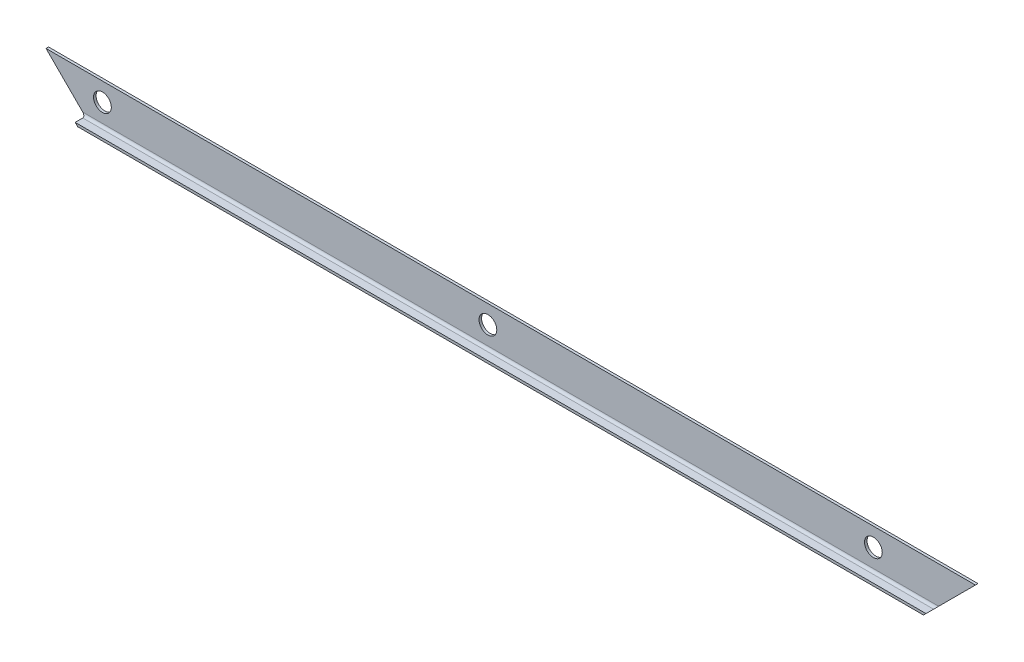
ISO-10303-21;
HEADER;
FILE_DESCRIPTION(('STEP AP214'),'2;1');
FILE_NAME('part.step','',(''),(''),'','','');
FILE_SCHEMA(('AUTOMOTIVE_DESIGN { 1 0 10303 214 1 1 1 1 }'));
ENDSEC;
DATA;
#1=APPLICATION_CONTEXT('core data for automotive mechanical design processes');
#2=APPLICATION_PROTOCOL_DEFINITION('international standard','automotive_design',2000,#1);
#3=PRODUCT_CONTEXT('',#1,'mechanical');
#4=PRODUCT('Part','Part','',(#3));
#5=PRODUCT_RELATED_PRODUCT_CATEGORY('part','',(#4));
#6=PRODUCT_DEFINITION_FORMATION('','',#4);
#7=PRODUCT_DEFINITION_CONTEXT('part definition',#1,'design');
#8=PRODUCT_DEFINITION('design','',#6,#7);
#9=PRODUCT_DEFINITION_SHAPE('','',#8);
#10=(LENGTH_UNIT() NAMED_UNIT(*) SI_UNIT(.MILLI.,.METRE.));
#11=(NAMED_UNIT(*) PLANE_ANGLE_UNIT() SI_UNIT($,.RADIAN.));
#12=(NAMED_UNIT(*) SI_UNIT($,.STERADIAN.) SOLID_ANGLE_UNIT());
#13=UNCERTAINTY_MEASURE_WITH_UNIT(LENGTH_MEASURE(1.E-05),#10,'distance_accuracy_value','');
#14=(GEOMETRIC_REPRESENTATION_CONTEXT(3) GLOBAL_UNCERTAINTY_ASSIGNED_CONTEXT((#13)) GLOBAL_UNIT_ASSIGNED_CONTEXT((#10,
#11,#12)) REPRESENTATION_CONTEXT('',''));
#15=CARTESIAN_POINT('',(0.,0.,0.));
#16=DIRECTION('',(0.,0.,1.));
#17=DIRECTION('',(1.,0.,0.));
#18=AXIS2_PLACEMENT_3D('',#15,#16,#17);
#19=CARTESIAN_POINT('',(0.,0.,-2.));
#20=DIRECTION('',(0.,0.,-1.));
#21=DIRECTION('',(-1.,0.,0.));
#22=AXIS2_PLACEMENT_3D('',#19,#20,#21);
#23=PLANE('',#22);
#24=CARTESIAN_POINT('',(285.999999999994,2.,-2.));
#25=DIRECTION('',(0.,0.,-1.));
#26=DIRECTION('',(-1.,0.,0.));
#27=AXIS2_PLACEMENT_3D('',#24,#25,#26);
#28=CIRCLE('',#27,7.00000000000005);
#29=CARTESIAN_POINT('',(278.999999999994,2.,-2.));
#30=VERTEX_POINT('',#29);
#31=EDGE_CURVE('E148',#30,#30,#28,.T.);
#32=ORIENTED_EDGE('',*,*,#31,.F.);
#33=EDGE_LOOP('',(#32));
#34=FACE_BOUND('',#33,.T.);
#35=CARTESIAN_POINT('',(-18.0000000000063,2.,-2.));
#36=DIRECTION('',(0.,0.,-1.));
#37=DIRECTION('',(-1.,0.,0.));
#38=AXIS2_PLACEMENT_3D('',#35,#36,#37);
#39=CIRCLE('',#38,7.00000000000004);
#40=CARTESIAN_POINT('',(-25.0000000000064,2.,-2.));
#41=VERTEX_POINT('',#40);
#42=EDGE_CURVE('E203',#41,#41,#39,.T.);
#43=ORIENTED_EDGE('',*,*,#42,.F.);
#44=EDGE_LOOP('',(#43));
#45=FACE_BOUND('',#44,.T.);
#46=CARTESIAN_POINT('',(-322.000000000006,2.,-2.));
#47=DIRECTION('',(0.,0.,-1.));
#48=DIRECTION('',(-1.,0.,0.));
#49=AXIS2_PLACEMENT_3D('',#46,#47,#48);
#50=CIRCLE('',#49,7.00000000000005);
#51=CARTESIAN_POINT('',(-329.000000000006,2.,-2.));
#52=VERTEX_POINT('',#51);
#53=EDGE_CURVE('E195',#52,#52,#50,.T.);
#54=ORIENTED_EDGE('',*,*,#53,.F.);
#55=EDGE_LOOP('',(#54));
#56=FACE_BOUND('',#55,.T.);
#57=DIRECTION('',(-1.,0.,0.));
#58=VECTOR('',#57,1.);
#59=CARTESIAN_POINT('',(-540.,16.5,-2.));
#60=LINE('',#59,#58);
#61=CARTESIAN_POINT('',(366.500000000006,16.5,-2.));
#62=VERTEX_POINT('',#61);
#63=CARTESIAN_POINT('',(-366.500000000006,16.5,-2.));
#64=VERTEX_POINT('',#63);
#65=EDGE_CURVE('E128',#62,#64,#60,.T.);
#66=ORIENTED_EDGE('',*,*,#65,.F.);
#67=DIRECTION('',(-0.707106781186551,-0.707106781186544,0.));
#68=VECTOR('',#67,1.);
#69=CARTESIAN_POINT('',(175.000000000001,-175.000000000003,-2.));
#70=LINE('',#69,#68);
#71=CARTESIAN_POINT('',(337.500000000006,-12.5,-2.00000000000003));
#72=VERTEX_POINT('',#71);
#73=EDGE_CURVE('E187',#62,#72,#70,.T.);
#74=ORIENTED_EDGE('',*,*,#73,.T.);
#75=DIRECTION('',(1.,0.,0.));
#76=VECTOR('',#75,1.);
#77=CARTESIAN_POINT('',(540.,-12.5,-2.00000000000003));
#78=LINE('',#77,#76);
#79=CARTESIAN_POINT('',(-337.500000000006,-12.5,-2.00000000000003));
#80=VERTEX_POINT('',#79);
#81=EDGE_CURVE('E149',#72,#80,#78,.F.);
#82=ORIENTED_EDGE('',*,*,#81,.T.);
#83=DIRECTION('',(-0.707106781186551,0.707106781186544,0.));
#84=VECTOR('',#83,1.);
#85=CARTESIAN_POINT('',(-175.000000000001,-175.000000000003,-2.));
#86=LINE('',#85,#84);
#87=EDGE_CURVE('E173',#80,#64,#86,.T.);
#88=ORIENTED_EDGE('',*,*,#87,.T.);
#89=EDGE_LOOP('',(#66,#74,#82,#88));
#90=FACE_BOUND('',#89,.T.);
#91=ADVANCED_FACE('F59',(#34,#45,#56,#90),#23,.T.);
#92=CARTESIAN_POINT('',(0.,0.,0.));
#93=DIRECTION('',(0.,0.,-1.));
#94=DIRECTION('',(-1.,0.,0.));
#95=AXIS2_PLACEMENT_3D('',#92,#93,#94);
#96=PLANE('',#95);
#97=CARTESIAN_POINT('',(285.999999999994,2.,0.));
#98=DIRECTION('',(0.,0.,1.));
#99=DIRECTION('',(1.,0.,0.));
#100=AXIS2_PLACEMENT_3D('',#97,#98,#99);
#101=CIRCLE('',#100,7.00000000000005);
#102=CARTESIAN_POINT('',(292.999999999994,2.,0.));
#103=VERTEX_POINT('',#102);
#104=EDGE_CURVE('E191',#103,#103,#101,.T.);
#105=ORIENTED_EDGE('',*,*,#104,.F.);
#106=EDGE_LOOP('',(#105));
#107=FACE_BOUND('',#106,.T.);
#108=CARTESIAN_POINT('',(-18.0000000000063,2.,0.));
#109=DIRECTION('',(0.,0.,1.));
#110=DIRECTION('',(1.,0.,0.));
#111=AXIS2_PLACEMENT_3D('',#108,#109,#110);
#112=CIRCLE('',#111,7.00000000000004);
#113=CARTESIAN_POINT('',(-11.0000000000063,2.,0.));
#114=VERTEX_POINT('',#113);
#115=EDGE_CURVE('E196',#114,#114,#112,.T.);
#116=ORIENTED_EDGE('',*,*,#115,.F.);
#117=EDGE_LOOP('',(#116));
#118=FACE_BOUND('',#117,.T.);
#119=CARTESIAN_POINT('',(-322.000000000006,2.,0.));
#120=DIRECTION('',(0.,0.,1.));
#121=DIRECTION('',(1.,0.,0.));
#122=AXIS2_PLACEMENT_3D('',#119,#120,#121);
#123=CIRCLE('',#122,7.00000000000005);
#124=CARTESIAN_POINT('',(-315.000000000006,2.,0.));
#125=VERTEX_POINT('',#124);
#126=EDGE_CURVE('E192',#125,#125,#123,.T.);
#127=ORIENTED_EDGE('',*,*,#126,.F.);
#128=EDGE_LOOP('',(#127));
#129=FACE_BOUND('',#128,.T.);
#130=DIRECTION('',(-0.707106781186551,-0.707106781186544,0.));
#131=VECTOR('',#130,1.);
#132=CARTESIAN_POINT('',(175.000000000001,-175.000000000003,0.));
#133=LINE('',#132,#131);
#134=CARTESIAN_POINT('',(366.500000000006,16.5,0.));
#135=VERTEX_POINT('',#134);
#136=CARTESIAN_POINT('',(337.500000000006,-12.5,0.));
#137=VERTEX_POINT('',#136);
#138=EDGE_CURVE('E165',#135,#137,#133,.T.);
#139=ORIENTED_EDGE('',*,*,#138,.F.);
#140=DIRECTION('',(-1.,0.,0.));
#141=VECTOR('',#140,1.);
#142=CARTESIAN_POINT('',(-540.,16.5,0.));
#143=LINE('',#142,#141);
#144=CARTESIAN_POINT('',(-366.500000000006,16.5,0.));
#145=VERTEX_POINT('',#144);
#146=EDGE_CURVE('E152',#135,#145,#143,.T.);
#147=ORIENTED_EDGE('',*,*,#146,.T.);
#148=DIRECTION('',(-0.707106781186551,0.707106781186544,0.));
#149=VECTOR('',#148,1.);
#150=CARTESIAN_POINT('',(-175.000000000001,-175.000000000003,0.));
#151=LINE('',#150,#149);
#152=CARTESIAN_POINT('',(-337.500000000006,-12.5,0.));
#153=VERTEX_POINT('',#152);
#154=EDGE_CURVE('E164',#153,#145,#151,.T.);
#155=ORIENTED_EDGE('',*,*,#154,.F.);
#156=DIRECTION('',(1.,0.,0.));
#157=VECTOR('',#156,1.);
#158=CARTESIAN_POINT('',(540.,-12.5,0.));
#159=LINE('',#158,#157);
#160=EDGE_CURVE('E141',#137,#153,#159,.F.);
#161=ORIENTED_EDGE('',*,*,#160,.F.);
#162=EDGE_LOOP('',(#139,#147,#155,#161));
#163=FACE_BOUND('',#162,.T.);
#164=ADVANCED_FACE('F162',(#107,#118,#129,#163),#96,.F.);
#165=CARTESIAN_POINT('',(-540.,16.5,-2.));
#166=DIRECTION('',(0.,1.,0.));
#167=DIRECTION('',(0.,0.,1.));
#168=AXIS2_PLACEMENT_3D('',#165,#166,#167);
#169=PLANE('',#168);
#170=ORIENTED_EDGE('',*,*,#146,.F.);
#171=DIRECTION('',(0.,0.,-1.));
#172=VECTOR('',#171,1.);
#173=CARTESIAN_POINT('',(366.500000000006,16.5,-2.));
#174=LINE('',#173,#172);
#175=EDGE_CURVE('E169',#135,#62,#174,.T.);
#176=ORIENTED_EDGE('',*,*,#175,.T.);
#177=ORIENTED_EDGE('',*,*,#65,.T.);
#178=DIRECTION('',(0.,0.,1.));
#179=VECTOR('',#178,1.);
#180=CARTESIAN_POINT('',(-366.500000000006,16.5,-2.));
#181=LINE('',#180,#179);
#182=EDGE_CURVE('E171',#64,#145,#181,.T.);
#183=ORIENTED_EDGE('',*,*,#182,.T.);
#184=EDGE_LOOP('',(#170,#176,#177,#183));
#185=FACE_BOUND('',#184,.T.);
#186=ADVANCED_FACE('F61',(#185),#169,.T.);
#187=CARTESIAN_POINT('',(540.,-12.5,1.99999999999997));
#188=DIRECTION('',(1.,0.,0.));
#189=DIRECTION('',(0.,-1.,0.));
#190=AXIS2_PLACEMENT_3D('',#187,#188,#189);
#191=CYLINDRICAL_SURFACE('',#190,4.);
#192=ORIENTED_EDGE('',*,*,#81,.F.);
#193=CARTESIAN_POINT('',(337.500000000006,-12.5,1.99999999999997));
#194=DIRECTION('',(0.707106781186544,-0.707106781186551,0.));
#195=DIRECTION('',(0.707106781186551,0.707106781186544,0.));
#196=AXIS2_PLACEMENT_3D('',#193,#194,#195);
#197=ELLIPSE('',#196,5.65685424949241,4.);
#198=CARTESIAN_POINT('',(333.500000000006,-16.5,1.99999999999993));
#199=VERTEX_POINT('',#198);
#200=EDGE_CURVE('E183',#72,#199,#197,.F.);
#201=ORIENTED_EDGE('',*,*,#200,.T.);
#202=DIRECTION('',(1.,0.,0.));
#203=VECTOR('',#202,1.);
#204=CARTESIAN_POINT('',(-540.,-16.5,1.99999999999999));
#205=LINE('',#204,#203);
#206=CARTESIAN_POINT('',(-333.500000000006,-16.5,1.99999999999993));
#207=VERTEX_POINT('',#206);
#208=EDGE_CURVE('E139',#199,#207,#205,.F.);
#209=ORIENTED_EDGE('',*,*,#208,.T.);
#210=CARTESIAN_POINT('',(-337.500000000006,-12.5,1.99999999999997));
#211=DIRECTION('',(-0.707106781186544,-0.707106781186551,0.));
#212=DIRECTION('',(0.707106781186551,-0.707106781186544,0.));
#213=AXIS2_PLACEMENT_3D('',#210,#211,#212);
#214=ELLIPSE('',#213,5.65685424949241,4.);
#215=EDGE_CURVE('E220',#207,#80,#214,.F.);
#216=ORIENTED_EDGE('',*,*,#215,.T.);
#217=EDGE_LOOP('',(#192,#201,#209,#216));
#218=FACE_BOUND('',#217,.T.);
#219=ADVANCED_FACE('F222',(#218),#191,.T.);
#220=CARTESIAN_POINT('',(540.,-12.5,1.99999999999997));
#221=DIRECTION('',(1.,0.,0.));
#222=DIRECTION('',(0.,-1.,0.));
#223=AXIS2_PLACEMENT_3D('',#220,#221,#222);
#224=CYLINDRICAL_SURFACE('',#223,2.);
#225=CARTESIAN_POINT('',(337.500000000006,-12.5,1.99999999999997));
#226=DIRECTION('',(0.707106781186544,-0.707106781186551,0.));
#227=DIRECTION('',(0.707106781186551,0.707106781186544,0.));
#228=AXIS2_PLACEMENT_3D('',#225,#226,#227);
#229=ELLIPSE('',#228,2.8284271247462,2.);
#230=CARTESIAN_POINT('',(335.500000000006,-14.5,1.99999999999994));
#231=VERTEX_POINT('',#230);
#232=EDGE_CURVE('E181',#137,#231,#229,.F.);
#233=ORIENTED_EDGE('',*,*,#232,.F.);
#234=ORIENTED_EDGE('',*,*,#160,.T.);
#235=CARTESIAN_POINT('',(-337.500000000006,-12.5,1.99999999999997));
#236=DIRECTION('',(-0.707106781186544,-0.707106781186551,0.));
#237=DIRECTION('',(0.707106781186551,-0.707106781186544,0.));
#238=AXIS2_PLACEMENT_3D('',#235,#236,#237);
#239=ELLIPSE('',#238,2.8284271247462,2.);
#240=CARTESIAN_POINT('',(-335.500000000006,-14.5,1.99999999999994));
#241=VERTEX_POINT('',#240);
#242=EDGE_CURVE('E224',#241,#153,#239,.F.);
#243=ORIENTED_EDGE('',*,*,#242,.F.);
#244=DIRECTION('',(1.,0.,0.));
#245=VECTOR('',#244,1.);
#246=CARTESIAN_POINT('',(-540.,-14.5,1.99999999999999));
#247=LINE('',#246,#245);
#248=EDGE_CURVE('E135',#241,#231,#247,.T.);
#249=ORIENTED_EDGE('',*,*,#248,.T.);
#250=EDGE_LOOP('',(#233,#234,#243,#249));
#251=FACE_BOUND('',#250,.T.);
#252=ADVANCED_FACE('F230',(#251),#224,.F.);
#253=CARTESIAN_POINT('',(0.,-16.5,0.));
#254=DIRECTION('',(0.,1.,0.));
#255=DIRECTION('',(0.,0.,1.));
#256=AXIS2_PLACEMENT_3D('',#253,#254,#255);
#257=PLANE('',#256);
#258=DIRECTION('',(0.,0.,-1.));
#259=VECTOR('',#258,1.);
#260=CARTESIAN_POINT('',(333.500000000006,-16.5,1.09283172109164E-12));
#261=LINE('',#260,#259);
#262=CARTESIAN_POINT('',(333.500000000006,-16.5000000000001,8.));
#263=VERTEX_POINT('',#262);
#264=EDGE_CURVE('E175',#263,#199,#261,.T.);
#265=ORIENTED_EDGE('',*,*,#264,.F.);
#266=DIRECTION('',(-1.,0.,0.));
#267=VECTOR('',#266,1.);
#268=CARTESIAN_POINT('',(0.,-16.5,8.));
#269=LINE('',#268,#267);
#270=CARTESIAN_POINT('',(-333.500000000006,-16.5000000000001,8.));
#271=VERTEX_POINT('',#270);
#272=EDGE_CURVE('E138',#263,#271,#269,.T.);
#273=ORIENTED_EDGE('',*,*,#272,.T.);
#274=DIRECTION('',(0.,0.,1.));
#275=VECTOR('',#274,1.);
#276=CARTESIAN_POINT('',(-333.500000000006,-16.5,1.09283172109164E-12));
#277=LINE('',#276,#275);
#278=EDGE_CURVE('E74',#207,#271,#277,.T.);
#279=ORIENTED_EDGE('',*,*,#278,.F.);
#280=ORIENTED_EDGE('',*,*,#208,.F.);
#281=EDGE_LOOP('',(#265,#273,#279,#280));
#282=FACE_BOUND('',#281,.T.);
#283=ADVANCED_FACE('F234',(#282),#257,.F.);
#284=CARTESIAN_POINT('',(0.,-14.5,0.));
#285=DIRECTION('',(0.,1.,0.));
#286=DIRECTION('',(0.,0.,1.));
#287=AXIS2_PLACEMENT_3D('',#284,#285,#286);
#288=PLANE('',#287);
#289=DIRECTION('',(1.,0.,0.));
#290=VECTOR('',#289,1.);
#291=CARTESIAN_POINT('',(-540.,-14.5,8.00000000000001));
#292=LINE('',#291,#290);
#293=CARTESIAN_POINT('',(335.500000000006,-14.5,8.00000000000001));
#294=VERTEX_POINT('',#293);
#295=CARTESIAN_POINT('',(-335.500000000006,-14.5,8.00000000000001));
#296=VERTEX_POINT('',#295);
#297=EDGE_CURVE('E133',#294,#296,#292,.F.);
#298=ORIENTED_EDGE('',*,*,#297,.F.);
#299=DIRECTION('',(0.,0.,-1.));
#300=VECTOR('',#299,1.);
#301=CARTESIAN_POINT('',(335.500000000006,-14.5,1.10675357767323E-12));
#302=LINE('',#301,#300);
#303=EDGE_CURVE('E81',#294,#231,#302,.T.);
#304=ORIENTED_EDGE('',*,*,#303,.T.);
#305=ORIENTED_EDGE('',*,*,#248,.F.);
#306=DIRECTION('',(0.,0.,1.));
#307=VECTOR('',#306,1.);
#308=CARTESIAN_POINT('',(-335.500000000006,-14.5,1.10675357767323E-12));
#309=LINE('',#308,#307);
#310=EDGE_CURVE('E122',#241,#296,#309,.T.);
#311=ORIENTED_EDGE('',*,*,#310,.T.);
#312=EDGE_LOOP('',(#298,#304,#305,#311));
#313=FACE_BOUND('',#312,.T.);
#314=ADVANCED_FACE('F132',(#313),#288,.T.);
#315=CARTESIAN_POINT('',(-540.,-16.5,8.));
#316=DIRECTION('',(0.,0.,-1.));
#317=DIRECTION('',(0.,1.,0.));
#318=AXIS2_PLACEMENT_3D('',#315,#316,#317);
#319=PLANE('',#318);
#320=DIRECTION('',(-0.707106781186551,-0.707106781186544,0.));
#321=VECTOR('',#320,1.);
#322=CARTESIAN_POINT('',(-103.250000000001,-453.250000000003,7.99999999999847));
#323=LINE('',#322,#321);
#324=EDGE_CURVE('E13',#294,#263,#323,.T.);
#325=ORIENTED_EDGE('',*,*,#324,.F.);
#326=ORIENTED_EDGE('',*,*,#297,.T.);
#327=DIRECTION('',(-0.707106781186551,0.707106781186544,0.));
#328=VECTOR('',#327,1.);
#329=CARTESIAN_POINT('',(-436.750000000004,86.749999999997,8.00000000000036));
#330=LINE('',#329,#328);
#331=EDGE_CURVE('E67',#271,#296,#330,.T.);
#332=ORIENTED_EDGE('',*,*,#331,.F.);
#333=ORIENTED_EDGE('',*,*,#272,.F.);
#334=EDGE_LOOP('',(#325,#326,#332,#333));
#335=FACE_BOUND('',#334,.T.);
#336=ADVANCED_FACE('F137',(#335),#319,.F.);
#337=CARTESIAN_POINT('',(-322.000000000006,2.,-10.));
#338=DIRECTION('',(0.,0.,1.));
#339=DIRECTION('',(1.,0.,0.));
#340=AXIS2_PLACEMENT_3D('',#337,#338,#339);
#341=CYLINDRICAL_SURFACE('',#340,7.00000000000005);
#342=ORIENTED_EDGE('',*,*,#53,.T.);
#343=EDGE_LOOP('',(#342));
#344=FACE_BOUND('',#343,.T.);
#345=ORIENTED_EDGE('',*,*,#126,.T.);
#346=EDGE_LOOP('',(#345));
#347=FACE_BOUND('',#346,.T.);
#348=ADVANCED_FACE('F248',(#344,#347),#341,.F.);
#349=CARTESIAN_POINT('',(-18.0000000000063,2.,-10.));
#350=DIRECTION('',(0.,0.,1.));
#351=DIRECTION('',(1.,0.,0.));
#352=AXIS2_PLACEMENT_3D('',#349,#350,#351);
#353=CYLINDRICAL_SURFACE('',#352,7.00000000000004);
#354=ORIENTED_EDGE('',*,*,#42,.T.);
#355=EDGE_LOOP('',(#354));
#356=FACE_BOUND('',#355,.T.);
#357=ORIENTED_EDGE('',*,*,#115,.T.);
#358=EDGE_LOOP('',(#357));
#359=FACE_BOUND('',#358,.T.);
#360=ADVANCED_FACE('F262',(#356,#359),#353,.F.);
#361=CARTESIAN_POINT('',(285.999999999994,2.,-10.));
#362=DIRECTION('',(0.,0.,1.));
#363=DIRECTION('',(1.,0.,0.));
#364=AXIS2_PLACEMENT_3D('',#361,#362,#363);
#365=CYLINDRICAL_SURFACE('',#364,7.00000000000005);
#366=ORIENTED_EDGE('',*,*,#31,.T.);
#367=EDGE_LOOP('',(#366));
#368=FACE_BOUND('',#367,.T.);
#369=ORIENTED_EDGE('',*,*,#104,.T.);
#370=EDGE_LOOP('',(#369));
#371=FACE_BOUND('',#370,.T.);
#372=ADVANCED_FACE('F208',(#368,#371),#365,.F.);
#373=CARTESIAN_POINT('',(-302.377446669408,-47.6225533305978,40.));
#374=DIRECTION('',(-0.707106781186544,-0.707106781186551,0.));
#375=DIRECTION('',(0.707106781186551,-0.707106781186544,0.));
#376=AXIS2_PLACEMENT_3D('',#373,#374,#375);
#377=PLANE('',#376);
#378=ORIENTED_EDGE('',*,*,#87,.F.);
#379=ORIENTED_EDGE('',*,*,#215,.F.);
#380=ORIENTED_EDGE('',*,*,#278,.T.);
#381=ORIENTED_EDGE('',*,*,#331,.T.);
#382=ORIENTED_EDGE('',*,*,#310,.F.);
#383=ORIENTED_EDGE('',*,*,#242,.T.);
#384=ORIENTED_EDGE('',*,*,#154,.T.);
#385=ORIENTED_EDGE('',*,*,#182,.F.);
#386=EDGE_LOOP('',(#378,#379,#380,#381,#382,#383,#384,#385));
#387=FACE_BOUND('',#386,.T.);
#388=ADVANCED_FACE('F121',(#387),#377,.T.);
#389=CARTESIAN_POINT('',(302.377446669408,-47.6225533305978,40.));
#390=DIRECTION('',(0.707106781186544,-0.707106781186551,0.));
#391=DIRECTION('',(0.707106781186551,0.707106781186544,0.));
#392=AXIS2_PLACEMENT_3D('',#389,#390,#391);
#393=PLANE('',#392);
#394=ORIENTED_EDGE('',*,*,#138,.T.);
#395=ORIENTED_EDGE('',*,*,#232,.T.);
#396=ORIENTED_EDGE('',*,*,#303,.F.);
#397=ORIENTED_EDGE('',*,*,#324,.T.);
#398=ORIENTED_EDGE('',*,*,#264,.T.);
#399=ORIENTED_EDGE('',*,*,#200,.F.);
#400=ORIENTED_EDGE('',*,*,#73,.F.);
#401=ORIENTED_EDGE('',*,*,#175,.F.);
#402=EDGE_LOOP('',(#394,#395,#396,#397,#398,#399,#400,#401));
#403=FACE_BOUND('',#402,.T.);
#404=ADVANCED_FACE('F231',(#403),#393,.T.);
#405=CLOSED_SHELL('',(#91,#164,#186,#219,#252,#283,#314,#336,#348,#360,#372,#388,#404));
#406=MANIFOLD_SOLID_BREP('B2',#405);
#407=ADVANCED_BREP_SHAPE_REPRESENTATION('',(#18,#406),#14);
#408=SHAPE_DEFINITION_REPRESENTATION(#9,#407);
ENDSEC;
END-ISO-10303-21;
